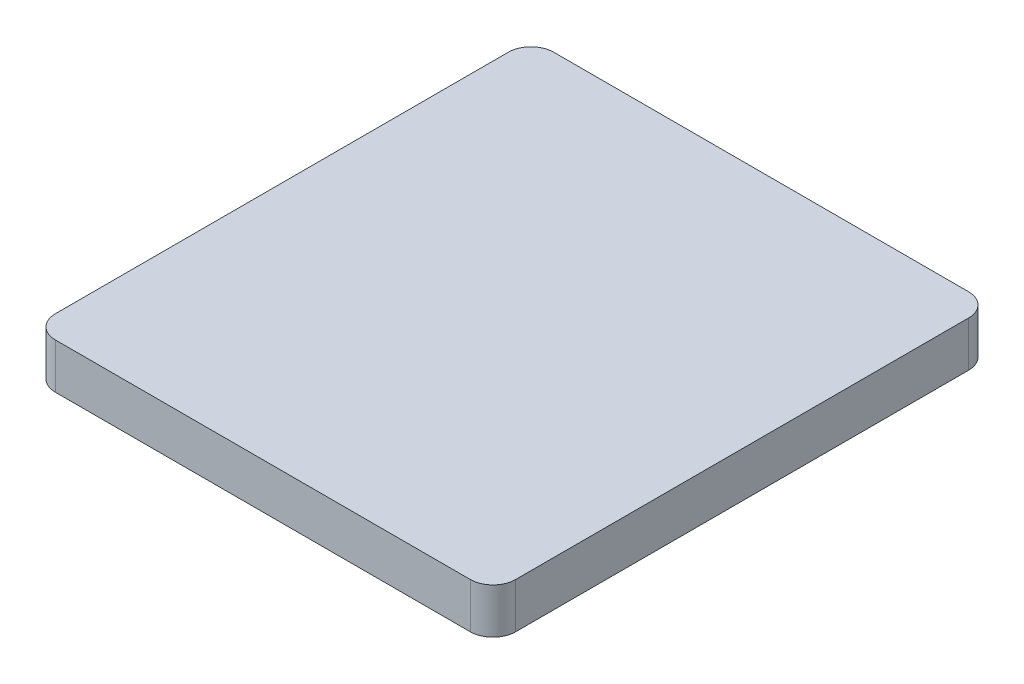
ISO-10303-21;
HEADER;
FILE_DESCRIPTION(('STEP AP214'),'2;1');
FILE_NAME('part.step','',(''),(''),'','','');
FILE_SCHEMA(('AUTOMOTIVE_DESIGN { 1 0 10303 214 1 1 1 1 }'));
ENDSEC;
DATA;
#1=APPLICATION_CONTEXT('core data for automotive mechanical design processes');
#2=APPLICATION_PROTOCOL_DEFINITION('international standard','automotive_design',2000,#1);
#3=PRODUCT_CONTEXT('',#1,'mechanical');
#4=PRODUCT('Part','Part','',(#3));
#5=PRODUCT_RELATED_PRODUCT_CATEGORY('part','',(#4));
#6=PRODUCT_DEFINITION_FORMATION('','',#4);
#7=PRODUCT_DEFINITION_CONTEXT('part definition',#1,'design');
#8=PRODUCT_DEFINITION('design','',#6,#7);
#9=PRODUCT_DEFINITION_SHAPE('','',#8);
#10=(LENGTH_UNIT() NAMED_UNIT(*) SI_UNIT(.MILLI.,.METRE.));
#11=(NAMED_UNIT(*) PLANE_ANGLE_UNIT() SI_UNIT($,.RADIAN.));
#12=(NAMED_UNIT(*) SI_UNIT($,.STERADIAN.) SOLID_ANGLE_UNIT());
#13=UNCERTAINTY_MEASURE_WITH_UNIT(LENGTH_MEASURE(1.E-05),#10,'distance_accuracy_value','');
#14=(GEOMETRIC_REPRESENTATION_CONTEXT(3) GLOBAL_UNCERTAINTY_ASSIGNED_CONTEXT((#13)) GLOBAL_UNIT_ASSIGNED_CONTEXT((#10,
#11,#12)) REPRESENTATION_CONTEXT('',''));
#15=CARTESIAN_POINT('',(0.,0.,0.));
#16=DIRECTION('',(0.,0.,1.));
#17=DIRECTION('',(1.,0.,0.));
#18=AXIS2_PLACEMENT_3D('',#15,#16,#17);
#19=CARTESIAN_POINT('',(-126.402683267555,1.,-137.570933988502));
#20=DIRECTION('',(1.,0.,0.));
#21=DIRECTION('',(0.,0.,1.));
#22=AXIS2_PLACEMENT_3D('',#19,#20,#21);
#23=PLANE('',#22);
#24=DIRECTION('',(0.,0.,1.));
#25=VECTOR('',#24,1.);
#26=CARTESIAN_POINT('',(-126.402683267555,0.,-137.570933988502));
#27=LINE('',#26,#25);
#28=CARTESIAN_POINT('',(-126.402683267555,0.,-137.070933988502));
#29=VERTEX_POINT('',#28);
#30=CARTESIAN_POINT('',(-126.402683267555,0.,-127.070933988502));
#31=VERTEX_POINT('',#30);
#32=EDGE_CURVE('E11',#29,#31,#27,.T.);
#33=ORIENTED_EDGE('',*,*,#32,.T.);
#34=DIRECTION('',(0.,1.,0.));
#35=VECTOR('',#34,1.);
#36=CARTESIAN_POINT('',(-126.402683267555,1.,-127.070933988502));
#37=LINE('',#36,#35);
#38=CARTESIAN_POINT('',(-126.402683267555,1.,-127.070933988502));
#39=VERTEX_POINT('',#38);
#40=EDGE_CURVE('E27',#31,#39,#37,.T.);
#41=ORIENTED_EDGE('',*,*,#40,.T.);
#42=DIRECTION('',(0.,0.,1.));
#43=VECTOR('',#42,1.);
#44=CARTESIAN_POINT('',(-126.402683267555,1.,-137.570933988502));
#45=LINE('',#44,#43);
#46=CARTESIAN_POINT('',(-126.402683267555,1.,-137.070933988502));
#47=VERTEX_POINT('',#46);
#48=EDGE_CURVE('E134',#47,#39,#45,.T.);
#49=ORIENTED_EDGE('',*,*,#48,.F.);
#50=DIRECTION('',(0.,-1.,0.));
#51=VECTOR('',#50,1.);
#52=CARTESIAN_POINT('',(-126.402683267555,1.,-137.070933988502));
#53=LINE('',#52,#51);
#54=EDGE_CURVE('E150',#47,#29,#53,.T.);
#55=ORIENTED_EDGE('',*,*,#54,.T.);
#56=EDGE_LOOP('',(#33,#41,#49,#55));
#57=FACE_BOUND('',#56,.T.);
#58=ADVANCED_FACE('F16',(#57),#23,.F.);
#59=CARTESIAN_POINT('',(-126.402683267555,1.,-126.570933988502));
#60=DIRECTION('',(0.,0.,-1.));
#61=DIRECTION('',(0.,-1.,0.));
#62=AXIS2_PLACEMENT_3D('',#59,#60,#61);
#63=PLANE('',#62);
#64=DIRECTION('',(1.,0.,0.));
#65=VECTOR('',#64,1.);
#66=CARTESIAN_POINT('',(-126.402683267555,0.,-126.570933988502));
#67=LINE('',#66,#65);
#68=CARTESIAN_POINT('',(-125.902683267555,0.,-126.570933988502));
#69=VERTEX_POINT('',#68);
#70=CARTESIAN_POINT('',(-116.742683267555,0.,-126.570933988502));
#71=VERTEX_POINT('',#70);
#72=EDGE_CURVE('E147',#69,#71,#67,.T.);
#73=ORIENTED_EDGE('',*,*,#72,.T.);
#74=DIRECTION('',(0.,1.,0.));
#75=VECTOR('',#74,1.);
#76=CARTESIAN_POINT('',(-116.742683267555,1.,-126.570933988502));
#77=LINE('',#76,#75);
#78=CARTESIAN_POINT('',(-116.742683267555,1.,-126.570933988502));
#79=VERTEX_POINT('',#78);
#80=EDGE_CURVE('E124',#71,#79,#77,.T.);
#81=ORIENTED_EDGE('',*,*,#80,.T.);
#82=DIRECTION('',(1.,0.,0.));
#83=VECTOR('',#82,1.);
#84=CARTESIAN_POINT('',(-126.402683267555,1.,-126.570933988502));
#85=LINE('',#84,#83);
#86=CARTESIAN_POINT('',(-125.902683267555,1.,-126.570933988502));
#87=VERTEX_POINT('',#86);
#88=EDGE_CURVE('E145',#87,#79,#85,.T.);
#89=ORIENTED_EDGE('',*,*,#88,.F.);
#90=DIRECTION('',(0.,-1.,0.));
#91=VECTOR('',#90,1.);
#92=CARTESIAN_POINT('',(-125.902683267555,1.,-126.570933988502));
#93=LINE('',#92,#91);
#94=EDGE_CURVE('E120',#87,#69,#93,.T.);
#95=ORIENTED_EDGE('',*,*,#94,.T.);
#96=EDGE_LOOP('',(#73,#81,#89,#95));
#97=FACE_BOUND('',#96,.T.);
#98=ADVANCED_FACE('F18',(#97),#63,.F.);
#99=CARTESIAN_POINT('',(-116.242683267555,1.,-137.570933988502));
#100=DIRECTION('',(-1.,0.,0.));
#101=DIRECTION('',(0.,0.,1.));
#102=AXIS2_PLACEMENT_3D('',#99,#100,#101);
#103=PLANE('',#102);
#104=DIRECTION('',(0.,0.,-1.));
#105=VECTOR('',#104,1.);
#106=CARTESIAN_POINT('',(-116.242683267555,1.,-137.570933988502));
#107=LINE('',#106,#105);
#108=CARTESIAN_POINT('',(-116.242683267555,1.,-127.070933988502));
#109=VERTEX_POINT('',#108);
#110=CARTESIAN_POINT('',(-116.242683267555,1.,-137.070933988502));
#111=VERTEX_POINT('',#110);
#112=EDGE_CURVE('E115',#109,#111,#107,.T.);
#113=ORIENTED_EDGE('',*,*,#112,.F.);
#114=DIRECTION('',(0.,-1.,0.));
#115=VECTOR('',#114,1.);
#116=CARTESIAN_POINT('',(-116.242683267555,1.,-127.070933988502));
#117=LINE('',#116,#115);
#118=CARTESIAN_POINT('',(-116.242683267555,0.,-127.070933988502));
#119=VERTEX_POINT('',#118);
#120=EDGE_CURVE('E111',#109,#119,#117,.T.);
#121=ORIENTED_EDGE('',*,*,#120,.T.);
#122=DIRECTION('',(0.,0.,-1.));
#123=VECTOR('',#122,1.);
#124=CARTESIAN_POINT('',(-116.242683267555,0.,-137.570933988502));
#125=LINE('',#124,#123);
#126=CARTESIAN_POINT('',(-116.242683267555,0.,-137.070933988502));
#127=VERTEX_POINT('',#126);
#128=EDGE_CURVE('E101',#119,#127,#125,.T.);
#129=ORIENTED_EDGE('',*,*,#128,.T.);
#130=DIRECTION('',(0.,1.,0.));
#131=VECTOR('',#130,1.);
#132=CARTESIAN_POINT('',(-116.242683267555,1.,-137.070933988502));
#133=LINE('',#132,#131);
#134=EDGE_CURVE('E92',#127,#111,#133,.T.);
#135=ORIENTED_EDGE('',*,*,#134,.T.);
#136=EDGE_LOOP('',(#113,#121,#129,#135));
#137=FACE_BOUND('',#136,.T.);
#138=ADVANCED_FACE('F114',(#137),#103,.F.);
#139=CARTESIAN_POINT('',(-126.402683267555,1.,-137.570933988502));
#140=DIRECTION('',(0.,0.,1.));
#141=DIRECTION('',(1.,0.,0.));
#142=AXIS2_PLACEMENT_3D('',#139,#140,#141);
#143=PLANE('',#142);
#144=DIRECTION('',(-1.,0.,0.));
#145=VECTOR('',#144,1.);
#146=CARTESIAN_POINT('',(-126.402683267555,0.,-137.570933988502));
#147=LINE('',#146,#145);
#148=CARTESIAN_POINT('',(-116.742683267555,0.,-137.570933988502));
#149=VERTEX_POINT('',#148);
#150=CARTESIAN_POINT('',(-125.902683267555,0.,-137.570933988502));
#151=VERTEX_POINT('',#150);
#152=EDGE_CURVE('E159',#149,#151,#147,.T.);
#153=ORIENTED_EDGE('',*,*,#152,.T.);
#154=DIRECTION('',(0.,1.,0.));
#155=VECTOR('',#154,1.);
#156=CARTESIAN_POINT('',(-125.902683267555,1.,-137.570933988502));
#157=LINE('',#156,#155);
#158=CARTESIAN_POINT('',(-125.902683267555,1.,-137.570933988502));
#159=VERTEX_POINT('',#158);
#160=EDGE_CURVE('E144',#151,#159,#157,.T.);
#161=ORIENTED_EDGE('',*,*,#160,.T.);
#162=DIRECTION('',(-1.,0.,0.));
#163=VECTOR('',#162,1.);
#164=CARTESIAN_POINT('',(-126.402683267555,1.,-137.570933988502));
#165=LINE('',#164,#163);
#166=CARTESIAN_POINT('',(-116.742683267555,1.,-137.570933988502));
#167=VERTEX_POINT('',#166);
#168=EDGE_CURVE('E170',#167,#159,#165,.T.);
#169=ORIENTED_EDGE('',*,*,#168,.F.);
#170=DIRECTION('',(0.,-1.,0.));
#171=VECTOR('',#170,1.);
#172=CARTESIAN_POINT('',(-116.742683267555,1.,-137.570933988502));
#173=LINE('',#172,#171);
#174=EDGE_CURVE('E141',#167,#149,#173,.T.);
#175=ORIENTED_EDGE('',*,*,#174,.T.);
#176=EDGE_LOOP('',(#153,#161,#169,#175));
#177=FACE_BOUND('',#176,.T.);
#178=ADVANCED_FACE('F205',(#177),#143,.F.);
#179=CARTESIAN_POINT('',(0.,1.,0.));
#180=DIRECTION('',(0.,1.,0.));
#181=DIRECTION('',(1.,0.,0.));
#182=AXIS2_PLACEMENT_3D('',#179,#180,#181);
#183=PLANE('',#182);
#184=ORIENTED_EDGE('',*,*,#88,.T.);
#185=CARTESIAN_POINT('',(-116.742683267555,1.,-127.070933988502));
#186=DIRECTION('',(0.,1.,0.));
#187=DIRECTION('',(0.,0.,1.));
#188=AXIS2_PLACEMENT_3D('',#185,#186,#187);
#189=CIRCLE('',#188,0.5);
#190=EDGE_CURVE('E154',#79,#109,#189,.T.);
#191=ORIENTED_EDGE('',*,*,#190,.T.);
#192=ORIENTED_EDGE('',*,*,#112,.T.);
#193=CARTESIAN_POINT('',(-116.742683267555,1.,-137.070933988502));
#194=DIRECTION('',(0.,1.,0.));
#195=DIRECTION('',(0.,0.,1.));
#196=AXIS2_PLACEMENT_3D('',#193,#194,#195);
#197=CIRCLE('',#196,0.5);
#198=EDGE_CURVE('E174',#111,#167,#197,.T.);
#199=ORIENTED_EDGE('',*,*,#198,.T.);
#200=ORIENTED_EDGE('',*,*,#168,.T.);
#201=CARTESIAN_POINT('',(-125.902683267555,1.,-137.070933988502));
#202=DIRECTION('',(0.,1.,0.));
#203=DIRECTION('',(0.,0.,1.));
#204=AXIS2_PLACEMENT_3D('',#201,#202,#203);
#205=CIRCLE('',#204,0.5);
#206=EDGE_CURVE('E166',#159,#47,#205,.T.);
#207=ORIENTED_EDGE('',*,*,#206,.T.);
#208=ORIENTED_EDGE('',*,*,#48,.T.);
#209=CARTESIAN_POINT('',(-125.902683267555,1.,-127.070933988502));
#210=DIRECTION('',(0.,1.,0.));
#211=DIRECTION('',(0.,0.,1.));
#212=AXIS2_PLACEMENT_3D('',#209,#210,#211);
#213=CIRCLE('',#212,0.5);
#214=EDGE_CURVE('E127',#39,#87,#213,.T.);
#215=ORIENTED_EDGE('',*,*,#214,.T.);
#216=EDGE_LOOP('',(#184,#191,#192,#199,#200,#207,#208,#215));
#217=FACE_BOUND('',#216,.T.);
#218=ADVANCED_FACE('F201',(#217),#183,.T.);
#219=CARTESIAN_POINT('',(0.,0.,0.));
#220=DIRECTION('',(0.,1.,0.));
#221=DIRECTION('',(1.,0.,0.));
#222=AXIS2_PLACEMENT_3D('',#219,#220,#221);
#223=PLANE('',#222);
#224=ORIENTED_EDGE('',*,*,#128,.F.);
#225=CARTESIAN_POINT('',(-116.742683267555,0.,-127.070933988502));
#226=DIRECTION('',(0.,-1.,0.));
#227=DIRECTION('',(0.,0.,1.));
#228=AXIS2_PLACEMENT_3D('',#225,#226,#227);
#229=CIRCLE('',#228,0.5);
#230=EDGE_CURVE('E106',#119,#71,#229,.T.);
#231=ORIENTED_EDGE('',*,*,#230,.T.);
#232=ORIENTED_EDGE('',*,*,#72,.F.);
#233=CARTESIAN_POINT('',(-125.902683267555,0.,-127.070933988502));
#234=DIRECTION('',(0.,-1.,0.));
#235=DIRECTION('',(0.,0.,1.));
#236=AXIS2_PLACEMENT_3D('',#233,#234,#235);
#237=CIRCLE('',#236,0.5);
#238=EDGE_CURVE('E20',#69,#31,#237,.T.);
#239=ORIENTED_EDGE('',*,*,#238,.T.);
#240=ORIENTED_EDGE('',*,*,#32,.F.);
#241=CARTESIAN_POINT('',(-125.902683267555,0.,-137.070933988502));
#242=DIRECTION('',(0.,-1.,0.));
#243=DIRECTION('',(0.,0.,1.));
#244=AXIS2_PLACEMENT_3D('',#241,#242,#243);
#245=CIRCLE('',#244,0.5);
#246=EDGE_CURVE('E137',#29,#151,#245,.T.);
#247=ORIENTED_EDGE('',*,*,#246,.T.);
#248=ORIENTED_EDGE('',*,*,#152,.F.);
#249=CARTESIAN_POINT('',(-116.742683267555,0.,-137.070933988502));
#250=DIRECTION('',(0.,-1.,0.));
#251=DIRECTION('',(0.,0.,1.));
#252=AXIS2_PLACEMENT_3D('',#249,#250,#251);
#253=CIRCLE('',#252,0.5);
#254=EDGE_CURVE('E108',#149,#127,#253,.T.);
#255=ORIENTED_EDGE('',*,*,#254,.T.);
#256=EDGE_LOOP('',(#224,#231,#232,#239,#240,#247,#248,#255));
#257=FACE_BOUND('',#256,.T.);
#258=ADVANCED_FACE('F103',(#257),#223,.F.);
#259=CARTESIAN_POINT('',(-116.742683267555,1.,-127.070933988502));
#260=DIRECTION('',(0.,-1.,0.));
#261=DIRECTION('',(0.,0.,-1.));
#262=AXIS2_PLACEMENT_3D('',#259,#260,#261);
#263=CYLINDRICAL_SURFACE('',#262,0.5);
#264=ORIENTED_EDGE('',*,*,#190,.F.);
#265=ORIENTED_EDGE('',*,*,#80,.F.);
#266=ORIENTED_EDGE('',*,*,#230,.F.);
#267=ORIENTED_EDGE('',*,*,#120,.F.);
#268=EDGE_LOOP('',(#264,#265,#266,#267));
#269=FACE_BOUND('',#268,.T.);
#270=ADVANCED_FACE('F122',(#269),#263,.T.);
#271=CARTESIAN_POINT('',(-125.902683267555,1.,-127.070933988502));
#272=DIRECTION('',(0.,-1.,0.));
#273=DIRECTION('',(0.,0.,-1.));
#274=AXIS2_PLACEMENT_3D('',#271,#272,#273);
#275=CYLINDRICAL_SURFACE('',#274,0.5);
#276=ORIENTED_EDGE('',*,*,#214,.F.);
#277=ORIENTED_EDGE('',*,*,#40,.F.);
#278=ORIENTED_EDGE('',*,*,#238,.F.);
#279=ORIENTED_EDGE('',*,*,#94,.F.);
#280=EDGE_LOOP('',(#276,#277,#278,#279));
#281=FACE_BOUND('',#280,.T.);
#282=ADVANCED_FACE('F218',(#281),#275,.T.);
#283=CARTESIAN_POINT('',(-125.902683267555,1.,-137.070933988502));
#284=DIRECTION('',(0.,-1.,0.));
#285=DIRECTION('',(0.,0.,-1.));
#286=AXIS2_PLACEMENT_3D('',#283,#284,#285);
#287=CYLINDRICAL_SURFACE('',#286,0.5);
#288=ORIENTED_EDGE('',*,*,#206,.F.);
#289=ORIENTED_EDGE('',*,*,#160,.F.);
#290=ORIENTED_EDGE('',*,*,#246,.F.);
#291=ORIENTED_EDGE('',*,*,#54,.F.);
#292=EDGE_LOOP('',(#288,#289,#290,#291));
#293=FACE_BOUND('',#292,.T.);
#294=ADVANCED_FACE('F220',(#293),#287,.T.);
#295=CARTESIAN_POINT('',(-116.742683267555,1.,-137.070933988502));
#296=DIRECTION('',(0.,-1.,0.));
#297=DIRECTION('',(0.,0.,-1.));
#298=AXIS2_PLACEMENT_3D('',#295,#296,#297);
#299=CYLINDRICAL_SURFACE('',#298,0.5);
#300=ORIENTED_EDGE('',*,*,#198,.F.);
#301=ORIENTED_EDGE('',*,*,#134,.F.);
#302=ORIENTED_EDGE('',*,*,#254,.F.);
#303=ORIENTED_EDGE('',*,*,#174,.F.);
#304=EDGE_LOOP('',(#300,#301,#302,#303));
#305=FACE_BOUND('',#304,.T.);
#306=ADVANCED_FACE('F206',(#305),#299,.T.);
#307=CLOSED_SHELL('',(#58,#98,#138,#178,#218,#258,#270,#282,#294,#306));
#308=MANIFOLD_SOLID_BREP('B1',#307);
#309=ADVANCED_BREP_SHAPE_REPRESENTATION('',(#18,#308),#14);
#310=SHAPE_DEFINITION_REPRESENTATION(#9,#309);
ENDSEC;
END-ISO-10303-21;
